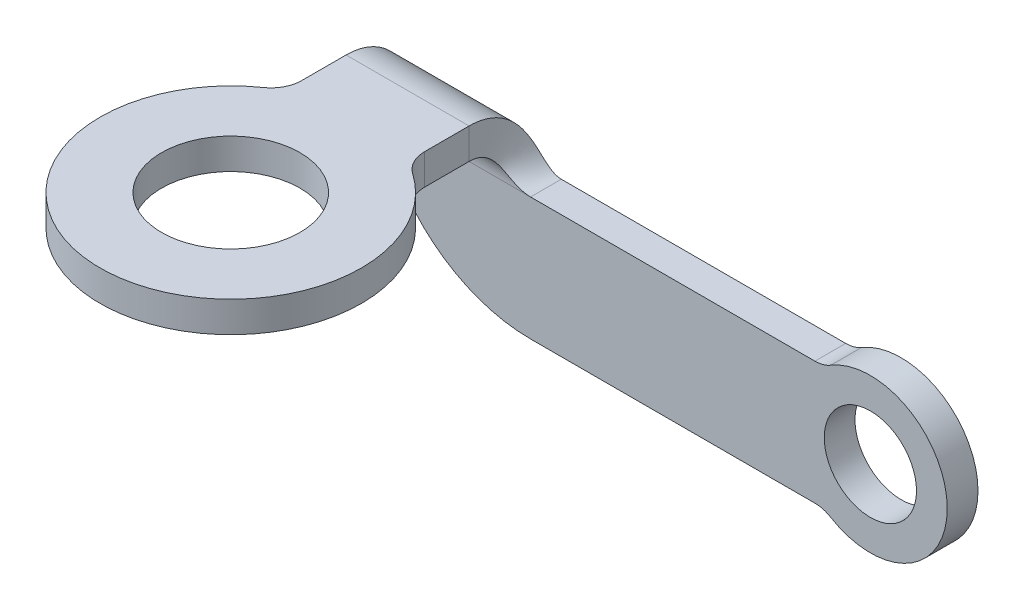
ISO-10303-21;
HEADER;
FILE_DESCRIPTION(('STEP AP214'),'2;1');
FILE_NAME('part.step','',(''),(''),'','','');
FILE_SCHEMA(('AUTOMOTIVE_DESIGN { 1 0 10303 214 1 1 1 1 }'));
ENDSEC;
DATA;
#1=APPLICATION_CONTEXT('core data for automotive mechanical design processes');
#2=APPLICATION_PROTOCOL_DEFINITION('international standard','automotive_design',2000,#1);
#3=PRODUCT_CONTEXT('',#1,'mechanical');
#4=PRODUCT('Part','Part','',(#3));
#5=PRODUCT_RELATED_PRODUCT_CATEGORY('part','',(#4));
#6=PRODUCT_DEFINITION_FORMATION('','',#4);
#7=PRODUCT_DEFINITION_CONTEXT('part definition',#1,'design');
#8=PRODUCT_DEFINITION('design','',#6,#7);
#9=PRODUCT_DEFINITION_SHAPE('','',#8);
#10=(LENGTH_UNIT() NAMED_UNIT(*) SI_UNIT(.MILLI.,.METRE.));
#11=(NAMED_UNIT(*) PLANE_ANGLE_UNIT() SI_UNIT($,.RADIAN.));
#12=(NAMED_UNIT(*) SI_UNIT($,.STERADIAN.) SOLID_ANGLE_UNIT());
#13=UNCERTAINTY_MEASURE_WITH_UNIT(LENGTH_MEASURE(1.E-05),#10,'distance_accuracy_value','');
#14=(GEOMETRIC_REPRESENTATION_CONTEXT(3) GLOBAL_UNCERTAINTY_ASSIGNED_CONTEXT((#13)) GLOBAL_UNIT_ASSIGNED_CONTEXT((#10,
#11,#12)) REPRESENTATION_CONTEXT('',''));
#15=CARTESIAN_POINT('',(0.,0.,0.));
#16=DIRECTION('',(0.,0.,1.));
#17=DIRECTION('',(1.,0.,0.));
#18=AXIS2_PLACEMENT_3D('',#15,#16,#17);
#19=CARTESIAN_POINT('',(8.,-11.,1.));
#20=DIRECTION('',(0.,1.,0.));
#21=DIRECTION('',(-1.,0.,0.));
#22=AXIS2_PLACEMENT_3D('',#19,#20,#21);
#23=PLANE('',#22);
#24=DIRECTION('',(0.,0.,1.));
#25=VECTOR('',#24,1.);
#26=CARTESIAN_POINT('',(10.,-11.,1.));
#27=LINE('',#26,#25);
#28=CARTESIAN_POINT('',(10.,-11.,-1.));
#29=VERTEX_POINT('',#28);
#30=CARTESIAN_POINT('',(10.,-11.,1.));
#31=VERTEX_POINT('',#30);
#32=EDGE_CURVE('E11',#29,#31,#27,.T.);
#33=ORIENTED_EDGE('',*,*,#32,.F.);
#34=DIRECTION('',(1.,0.,0.));
#35=VECTOR('',#34,1.);
#36=CARTESIAN_POINT('',(8.,-11.,-1.));
#37=LINE('',#36,#35);
#38=CARTESIAN_POINT('',(28.494448724536,-11.,-1.));
#39=VERTEX_POINT('',#38);
#40=EDGE_CURVE('E141',#39,#29,#37,.F.);
#41=ORIENTED_EDGE('',*,*,#40,.F.);
#42=DIRECTION('',(0.,0.,1.));
#43=VECTOR('',#42,1.);
#44=CARTESIAN_POINT('',(28.494448724536,-11.,1.));
#45=LINE('',#44,#43);
#46=CARTESIAN_POINT('',(28.494448724536,-11.,1.));
#47=VERTEX_POINT('',#46);
#48=EDGE_CURVE('E50',#39,#47,#45,.T.);
#49=ORIENTED_EDGE('',*,*,#48,.T.);
#50=DIRECTION('',(-1.,0.,0.));
#51=VECTOR('',#50,1.);
#52=CARTESIAN_POINT('',(8.,-11.,1.));
#53=LINE('',#52,#51);
#54=EDGE_CURVE('E365',#47,#31,#53,.T.);
#55=ORIENTED_EDGE('',*,*,#54,.T.);
#56=EDGE_LOOP('',(#33,#41,#49,#55));
#57=FACE_BOUND('',#56,.T.);
#58=ADVANCED_FACE('F38',(#57),#23,.F.);
#59=CARTESIAN_POINT('',(28.494448724536,-13.,1.));
#60=DIRECTION('',(0.,0.,1.));
#61=DIRECTION('',(1.,0.,0.));
#62=AXIS2_PLACEMENT_3D('',#59,#60,#61);
#63=CYLINDRICAL_SURFACE('',#62,2.);
#64=ORIENTED_EDGE('',*,*,#48,.F.);
#65=CARTESIAN_POINT('',(28.494448724536,-13.,-1.));
#66=DIRECTION('',(0.,0.,1.));
#67=DIRECTION('',(1.,0.,0.));
#68=AXIS2_PLACEMENT_3D('',#65,#66,#67);
#69=CIRCLE('',#68,2.);
#70=CARTESIAN_POINT('',(29.5246062318114,-11.2857142857143,-1.));
#71=VERTEX_POINT('',#70);
#72=EDGE_CURVE('E404',#39,#71,#69,.F.);
#73=ORIENTED_EDGE('',*,*,#72,.T.);
#74=DIRECTION('',(0.,0.,1.));
#75=VECTOR('',#74,1.);
#76=CARTESIAN_POINT('',(29.5246062318114,-11.2857142857143,1.));
#77=LINE('',#76,#75);
#78=CARTESIAN_POINT('',(29.5246062318114,-11.2857142857143,1.));
#79=VERTEX_POINT('',#78);
#80=EDGE_CURVE('E449',#71,#79,#77,.T.);
#81=ORIENTED_EDGE('',*,*,#80,.T.);
#82=CARTESIAN_POINT('',(28.494448724536,-13.,1.));
#83=DIRECTION('',(0.,0.,1.));
#84=DIRECTION('',(1.,0.,0.));
#85=AXIS2_PLACEMENT_3D('',#82,#83,#84);
#86=CIRCLE('',#85,2.);
#87=EDGE_CURVE('E367',#47,#79,#86,.F.);
#88=ORIENTED_EDGE('',*,*,#87,.F.);
#89=EDGE_LOOP('',(#64,#73,#81,#88));
#90=FACE_BOUND('',#89,.T.);
#91=ADVANCED_FACE('F465',(#90),#63,.F.);
#92=CARTESIAN_POINT('',(32.1,-7.00000000000001,1.));
#93=DIRECTION('',(0.,0.,1.));
#94=DIRECTION('',(1.,0.,0.));
#95=AXIS2_PLACEMENT_3D('',#92,#93,#94);
#96=CYLINDRICAL_SURFACE('',#95,5.);
#97=ORIENTED_EDGE('',*,*,#80,.F.);
#98=CARTESIAN_POINT('',(32.1,-7.00000000000001,-1.));
#99=DIRECTION('',(0.,0.,1.));
#100=DIRECTION('',(1.,0.,0.));
#101=AXIS2_PLACEMENT_3D('',#98,#99,#100);
#102=CIRCLE('',#101,5.);
#103=CARTESIAN_POINT('',(29.5246062318114,-2.71428571428574,-1.));
#104=VERTEX_POINT('',#103);
#105=EDGE_CURVE('E401',#71,#104,#102,.T.);
#106=ORIENTED_EDGE('',*,*,#105,.T.);
#107=DIRECTION('',(0.,0.,1.));
#108=VECTOR('',#107,1.);
#109=CARTESIAN_POINT('',(29.5246062318114,-2.71428571428574,1.));
#110=LINE('',#109,#108);
#111=CARTESIAN_POINT('',(29.5246062318114,-2.71428571428574,1.));
#112=VERTEX_POINT('',#111);
#113=EDGE_CURVE('E446',#104,#112,#110,.T.);
#114=ORIENTED_EDGE('',*,*,#113,.T.);
#115=CARTESIAN_POINT('',(32.1,-7.00000000000001,1.));
#116=DIRECTION('',(0.,0.,1.));
#117=DIRECTION('',(1.,0.,0.));
#118=AXIS2_PLACEMENT_3D('',#115,#116,#117);
#119=CIRCLE('',#118,5.);
#120=EDGE_CURVE('E315',#79,#112,#119,.T.);
#121=ORIENTED_EDGE('',*,*,#120,.F.);
#122=EDGE_LOOP('',(#97,#106,#114,#121));
#123=FACE_BOUND('',#122,.T.);
#124=ADVANCED_FACE('F466',(#123),#96,.T.);
#125=CARTESIAN_POINT('',(28.494448724536,-1.00000000000003,1.));
#126=DIRECTION('',(0.,0.,1.));
#127=DIRECTION('',(1.,0.,0.));
#128=AXIS2_PLACEMENT_3D('',#125,#126,#127);
#129=CYLINDRICAL_SURFACE('',#128,2.);
#130=ORIENTED_EDGE('',*,*,#113,.F.);
#131=CARTESIAN_POINT('',(28.494448724536,-1.00000000000003,-1.));
#132=DIRECTION('',(0.,0.,1.));
#133=DIRECTION('',(1.,0.,0.));
#134=AXIS2_PLACEMENT_3D('',#131,#132,#133);
#135=CIRCLE('',#134,2.);
#136=CARTESIAN_POINT('',(28.494448724536,-3.00000000000003,-1.));
#137=VERTEX_POINT('',#136);
#138=EDGE_CURVE('E393',#104,#137,#135,.F.);
#139=ORIENTED_EDGE('',*,*,#138,.T.);
#140=DIRECTION('',(0.,0.,1.));
#141=VECTOR('',#140,1.);
#142=CARTESIAN_POINT('',(28.494448724536,-3.00000000000003,1.));
#143=LINE('',#142,#141);
#144=CARTESIAN_POINT('',(28.494448724536,-3.00000000000003,1.));
#145=VERTEX_POINT('',#144);
#146=EDGE_CURVE('E440',#137,#145,#143,.T.);
#147=ORIENTED_EDGE('',*,*,#146,.T.);
#148=CARTESIAN_POINT('',(28.494448724536,-1.00000000000003,1.));
#149=DIRECTION('',(0.,0.,1.));
#150=DIRECTION('',(1.,0.,0.));
#151=AXIS2_PLACEMENT_3D('',#148,#149,#150);
#152=CIRCLE('',#151,2.);
#153=EDGE_CURVE('E311',#112,#145,#152,.F.);
#154=ORIENTED_EDGE('',*,*,#153,.F.);
#155=EDGE_LOOP('',(#130,#139,#147,#154));
#156=FACE_BOUND('',#155,.T.);
#157=ADVANCED_FACE('F444',(#156),#129,.F.);
#158=CARTESIAN_POINT('',(31.,-3.00000000000003,1.));
#159=DIRECTION('',(0.,1.,0.));
#160=DIRECTION('',(-1.,0.,0.));
#161=AXIS2_PLACEMENT_3D('',#158,#159,#160);
#162=PLANE('',#161);
#163=ORIENTED_EDGE('',*,*,#146,.F.);
#164=DIRECTION('',(1.,0.,0.));
#165=VECTOR('',#164,1.);
#166=CARTESIAN_POINT('',(8.,-3.00000000000003,-1.));
#167=LINE('',#166,#165);
#168=CARTESIAN_POINT('',(10.,-3.00000000000001,-1.));
#169=VERTEX_POINT('',#168);
#170=EDGE_CURVE('E137',#137,#169,#167,.F.);
#171=ORIENTED_EDGE('',*,*,#170,.T.);
#172=CARTESIAN_POINT('',(10.,-3.00000000000001,1.));
#173=CARTESIAN_POINT('',(10.,-3.00000000000003,-1.));
#174=B_SPLINE_CURVE_WITH_KNOTS('',1,(#172,#173),.UNSPECIFIED.,.F.,.F.,(2,2),(0.,1.),.UNSPECIFIED.);
#175=CARTESIAN_POINT('',(10.,-3.00000000000001,1.));
#176=VERTEX_POINT('',#175);
#177=EDGE_CURVE('E324',#169,#176,#174,.F.);
#178=ORIENTED_EDGE('',*,*,#177,.T.);
#179=DIRECTION('',(-1.,0.,0.));
#180=VECTOR('',#179,1.);
#181=CARTESIAN_POINT('',(31.,-3.00000000000003,1.));
#182=LINE('',#181,#180);
#183=EDGE_CURVE('E307',#145,#176,#182,.T.);
#184=ORIENTED_EDGE('',*,*,#183,.F.);
#185=EDGE_LOOP('',(#163,#171,#178,#184));
#186=FACE_BOUND('',#185,.T.);
#187=ADVANCED_FACE('F229',(#186),#162,.T.);
#188=CARTESIAN_POINT('',(10.,-3.00000000000003,-1.));
#189=CARTESIAN_POINT('',(9.82093477541032,-3.00000000000003,-1.));
#190=CARTESIAN_POINT('',(9.64580122140493,-2.95273684578553,-1.00080865062304));
#191=CARTESIAN_POINT('',(9.30336473890208,-2.76626511587323,-0.99425483270518));
#192=CARTESIAN_POINT('',(9.13755224871009,-2.62611752530206,-0.986566989808087));
#193=CARTESIAN_POINT('',(8.83405868070301,-2.2689931419241,-0.936766876836849));
#194=CARTESIAN_POINT('',(8.69221728699317,-2.0458229083129,-0.893043014859959));
#195=CARTESIAN_POINT('',(8.51168645654295,-1.67754479086531,-0.777257163510993));
#196=CARTESIAN_POINT('',(8.45632197634519,-1.54879822740381,-0.730311712879765));
#197=CARTESIAN_POINT('',(8.35504028231837,-1.2813526416789,-0.614894648225614));
#198=CARTESIAN_POINT('',(8.3089665706863,-1.14168907981914,-0.545675806509528));
#199=CARTESIAN_POINT('',(8.2294107009633,-0.866885772453496,-0.387471046838496));
#200=CARTESIAN_POINT('',(8.19536135329952,-0.730451480555486,-0.298065230284524));
#201=CARTESIAN_POINT('',(8.13704983269021,-0.462536017914824,-0.0966693857990296));
#202=CARTESIAN_POINT('',(8.11269448566674,-0.330142446376479,0.0163808530445416));
#203=CARTESIAN_POINT('',(8.07342327426585,-0.0817466546383528,0.25884696103896));
#204=CARTESIAN_POINT('',(8.0582483751741,0.0351941513241525,0.388739794267057));
#205=CARTESIAN_POINT('',(8.03437747330826,0.253166587555796,0.665906910192448));
#206=CARTESIAN_POINT('',(8.02568313458191,0.354566979721533,0.814054563014717));
#207=CARTESIAN_POINT('',(8.01304263541525,0.534925974437725,1.11963422968819));
#208=CARTESIAN_POINT('',(8.00900018172403,0.61464752403954,1.27783423806854));
#209=CARTESIAN_POINT('',(8.0035140715089,0.75303161016686,1.60490668136411));
#210=CARTESIAN_POINT('',(8.00207332198609,0.811963269080384,1.774986775512));
#211=CARTESIAN_POINT('',(7.99958972016319,0.952647391751701,2.29044798891665));
#212=CARTESIAN_POINT('',(8.,0.999999999999998,2.64152132330197));
#213=CARTESIAN_POINT('',(8.,1.,2.99999999999998));
#214=CARTESIAN_POINT('',(10.,-3.00000000000001,1.));
#215=CARTESIAN_POINT('',(9.82093477541032,-3.00000000000001,1.));
#216=CARTESIAN_POINT('',(9.64580122140493,-2.97636842289277,0.999595674688481));
#217=CARTESIAN_POINT('',(9.30336473890208,-2.88313255793662,1.00287258364741));
#218=CARTESIAN_POINT('',(9.13755224871009,-2.81305876265103,1.00671650509596));
#219=CARTESIAN_POINT('',(8.83405868070301,-2.63449657096205,1.03161656158158));
#220=CARTESIAN_POINT('',(8.69221728699317,-2.52291145415645,1.05347849257002));
#221=CARTESIAN_POINT('',(8.51168645654295,-2.33877239543265,1.1113714182445));
#222=CARTESIAN_POINT('',(8.45632197634519,-2.27439911370191,1.13484414356012));
#223=CARTESIAN_POINT('',(8.35504028231837,-2.14067632083945,1.19255267588719));
#224=CARTESIAN_POINT('',(8.3089665706863,-2.07084453990957,1.22716209674524));
#225=CARTESIAN_POINT('',(8.2294107009633,-1.93344288622675,1.30626447658075));
#226=CARTESIAN_POINT('',(8.19536135329952,-1.86522574027774,1.35096738485774));
#227=CARTESIAN_POINT('',(8.13704983269021,-1.73126800895741,1.45166530710049));
#228=CARTESIAN_POINT('',(8.11269448566674,-1.66507122318824,1.50819042652227));
#229=CARTESIAN_POINT('',(8.07342327426585,-1.54087332731918,1.62942348051948));
#230=CARTESIAN_POINT('',(8.0582483751741,-1.48240292433792,1.69436989713353));
#231=CARTESIAN_POINT('',(8.03437747330826,-1.3734167062221,1.83295345509622));
#232=CARTESIAN_POINT('',(8.02568313458191,-1.32271651013923,1.90702728150736));
#233=CARTESIAN_POINT('',(8.01304263541525,-1.23253701278114,2.05981711484409));
#234=CARTESIAN_POINT('',(8.00900018172403,-1.19267623798023,2.13891711903427));
#235=CARTESIAN_POINT('',(8.0035140715089,-1.12348419491657,2.30245334068206));
#236=CARTESIAN_POINT('',(8.00207332198609,-1.09401836545981,2.387493387756));
#237=CARTESIAN_POINT('',(7.99958972016319,-1.02367630412415,2.64522399445832));
#238=CARTESIAN_POINT('',(8.,-1.,2.82076066165099));
#239=CARTESIAN_POINT('',(8.,-1.,2.99999999999999));
#240=B_SPLINE_SURFACE_WITH_KNOTS('',1,3,((#188,#189,#190,#191,#192,#193,#194,#195,#196,#197,
#198,#199,#200,#201,#202,#203,#204,#205,#206,#207,#208,#209,#210,#211,#212,#213),(#214,#215,
#216,#217,#218,#219,#220,#221,#222,#223,#224,#225,#226,#227,#228,#229,#230,#231,#232,#233,#234,
#235,#236,#237,#238,#239)),.UNSPECIFIED.,.F.,.F.,.F.,(2,2),(4,2,2,2,2,2,2,2,2,2,2,2,4),(0.,1.),
(0.,0.000529781619363751,0.0010595632387275,0.00158934485809125,0.00185423566777313,
0.002119126477455,0.00238401728713688,0.00264890809681876,0.00291379890650063,
0.00317868971618251,0.00344358052586438,0.00370847133554626,0.00423825295491001),.UNSPECIFIED.);
#241=CARTESIAN_POINT('',(10.,-3.00000000000003,-1.));
#242=CARTESIAN_POINT('',(9.82093477541032,-3.00000000000003,-1.));
#243=CARTESIAN_POINT('',(9.64580122140493,-2.95273684578553,-1.00080865062304));
#244=CARTESIAN_POINT('',(9.30336473890208,-2.76626511587323,-0.99425483270518));
#245=CARTESIAN_POINT('',(9.13755224871009,-2.62611752530206,-0.986566989808087));
#246=CARTESIAN_POINT('',(8.83405868070301,-2.2689931419241,-0.936766876836849));
#247=CARTESIAN_POINT('',(8.69221728699317,-2.0458229083129,-0.893043014859959));
#248=CARTESIAN_POINT('',(8.51168645654295,-1.67754479086531,-0.777257163510993));
#249=CARTESIAN_POINT('',(8.45632197634519,-1.54879822740381,-0.730311712879765));
#250=CARTESIAN_POINT('',(8.35504028231837,-1.2813526416789,-0.614894648225614));
#251=CARTESIAN_POINT('',(8.3089665706863,-1.14168907981914,-0.545675806509528));
#252=CARTESIAN_POINT('',(8.2294107009633,-0.866885772453496,-0.387471046838496));
#253=CARTESIAN_POINT('',(8.19536135329952,-0.730451480555486,-0.298065230284524));
#254=CARTESIAN_POINT('',(8.13704983269021,-0.462536017914824,-0.0966693857990296));
#255=CARTESIAN_POINT('',(8.11269448566674,-0.330142446376479,0.0163808530445416));
#256=CARTESIAN_POINT('',(8.07342327426585,-0.0817466546383528,0.25884696103896));
#257=CARTESIAN_POINT('',(8.0582483751741,0.0351941513241525,0.388739794267057));
#258=CARTESIAN_POINT('',(8.03437747330826,0.253166587555796,0.665906910192448));
#259=CARTESIAN_POINT('',(8.02568313458191,0.354566979721533,0.814054563014717));
#260=CARTESIAN_POINT('',(8.01304263541525,0.534925974437725,1.11963422968819));
#261=CARTESIAN_POINT('',(8.00900018172403,0.61464752403954,1.27783423806854));
#262=CARTESIAN_POINT('',(8.0035140715089,0.75303161016686,1.60490668136411));
#263=CARTESIAN_POINT('',(8.00207332198609,0.811963269080384,1.774986775512));
#264=CARTESIAN_POINT('',(7.99958972016319,0.952647391751701,2.29044798891665));
#265=CARTESIAN_POINT('',(8.,0.999999999999998,2.64152132330197));
#266=CARTESIAN_POINT('',(8.,1.,2.99999999999998));
#267=B_SPLINE_CURVE_WITH_KNOTS('',3,(#241,#242,#243,#244,#245,#246,#247,#248,#249,#250,#251,
#252,#253,#254,#255,#256,#257,#258,#259,#260,#261,#262,#263,#264,#265,#266),.UNSPECIFIED.,.F.,
.F.,(4,2,2,2,2,2,2,2,2,2,2,2,4),(0.,0.000529781619363751,0.0010595632387275,0.00158934485809125,
0.00185423566777313,0.002119126477455,0.00238401728713688,0.00264890809681876,
0.00291379890650063,0.00317868971618251,0.00344358052586438,0.00370847133554626,
0.00423825295491001),.UNSPECIFIED.);
#268=CARTESIAN_POINT('',(8.,1.,3.00000000000004));
#269=VERTEX_POINT('',#268);
#270=EDGE_CURVE('E132',#169,#269,#267,.T.);
#271=CARTESIAN_POINT('',(8.,1.,2.99999999999998));
#272=CARTESIAN_POINT('',(8.,-1.,2.99999999999999));
#273=B_SPLINE_CURVE_WITH_KNOTS('',1,(#271,#272),.UNSPECIFIED.,.F.,.F.,(2,2),(0.,1.),.UNSPECIFIED.);
#274=CARTESIAN_POINT('',(8.,-1.,3.00000000000002));
#275=VERTEX_POINT('',#274);
#276=EDGE_CURVE('E204',#269,#275,#273,.T.);
#277=CARTESIAN_POINT('',(8.,-1.,2.99999999999999));
#278=CARTESIAN_POINT('',(8.,-1.,2.82076066165099));
#279=CARTESIAN_POINT('',(7.99958972016319,-1.02367630412415,2.64522399445832));
#280=CARTESIAN_POINT('',(8.00207332198609,-1.09401836545981,2.387493387756));
#281=CARTESIAN_POINT('',(8.0035140715089,-1.12348419491657,2.30245334068206));
#282=CARTESIAN_POINT('',(8.00900018172403,-1.19267623798023,2.13891711903427));
#283=CARTESIAN_POINT('',(8.01304263541525,-1.23253701278114,2.05981711484409));
#284=CARTESIAN_POINT('',(8.02568313458191,-1.32271651013923,1.90702728150736));
#285=CARTESIAN_POINT('',(8.03437747330826,-1.3734167062221,1.83295345509622));
#286=CARTESIAN_POINT('',(8.0582483751741,-1.48240292433792,1.69436989713353));
#287=CARTESIAN_POINT('',(8.07342327426585,-1.54087332731918,1.62942348051948));
#288=CARTESIAN_POINT('',(8.11269448566674,-1.66507122318824,1.50819042652227));
#289=CARTESIAN_POINT('',(8.13704983269021,-1.73126800895741,1.45166530710049));
#290=CARTESIAN_POINT('',(8.19536135329952,-1.86522574027774,1.35096738485774));
#291=CARTESIAN_POINT('',(8.2294107009633,-1.93344288622675,1.30626447658075));
#292=CARTESIAN_POINT('',(8.3089665706863,-2.07084453990957,1.22716209674524));
#293=CARTESIAN_POINT('',(8.35504028231837,-2.14067632083945,1.19255267588719));
#294=CARTESIAN_POINT('',(8.45632197634519,-2.27439911370191,1.13484414356012));
#295=CARTESIAN_POINT('',(8.51168645654295,-2.33877239543265,1.1113714182445));
#296=CARTESIAN_POINT('',(8.69221728699317,-2.52291145415645,1.05347849257002));
#297=CARTESIAN_POINT('',(8.83405868070301,-2.63449657096205,1.03161656158158));
#298=CARTESIAN_POINT('',(9.13755224871009,-2.81305876265103,1.00671650509596));
#299=CARTESIAN_POINT('',(9.30336473890208,-2.88313255793662,1.00287258364741));
#300=CARTESIAN_POINT('',(9.64580122140493,-2.97636842289277,0.999595674688481));
#301=CARTESIAN_POINT('',(9.82093477541032,-3.00000000000001,1.));
#302=CARTESIAN_POINT('',(10.,-3.00000000000001,1.));
#303=B_SPLINE_CURVE_WITH_KNOTS('',3,(#277,#278,#279,#280,#281,#282,#283,#284,#285,#286,#287,
#288,#289,#290,#291,#292,#293,#294,#295,#296,#297,#298,#299,#300,#301,#302),.UNSPECIFIED.,.F.,
.F.,(4,2,2,2,2,2,2,2,2,2,2,2,4),(0.,0.000529781619363751,0.000794672429045627,
0.0010595632387275,0.00132445404840938,0.00158934485809125,0.00185423566777313,
0.002119126477455,0.00238401728713688,0.00264890809681876,0.00317868971618251,
0.00370847133554626,0.00423825295491001),.UNSPECIFIED.);
#304=EDGE_CURVE('E119',#176,#275,#303,.F.);
#305=ORIENTED_EDGE('',*,*,#177,.F.);
#306=ORIENTED_EDGE('',*,*,#270,.T.);
#307=ORIENTED_EDGE('',*,*,#276,.T.);
#308=ORIENTED_EDGE('',*,*,#304,.F.);
#309=EDGE_LOOP('',(#305,#306,#307,#308));
#310=FACE_BOUND('',#309,.T.);
#311=ADVANCED_FACE('F216',(#310),#240,.F.);
#312=CARTESIAN_POINT('',(8.,-1.,3.00000000000002));
#313=DIRECTION('',(1.,0.,0.));
#314=DIRECTION('',(0.,0.,1.));
#315=AXIS2_PLACEMENT_3D('',#312,#313,#314);
#316=PLANE('',#315);
#317=ORIENTED_EDGE('',*,*,#276,.F.);
#318=DIRECTION('',(0.,0.,-1.));
#319=VECTOR('',#318,1.);
#320=CARTESIAN_POINT('',(8.,1.,3.00000000000002));
#321=LINE('',#320,#319);
#322=CARTESIAN_POINT('',(8.,1.,5.88315603019296));
#323=VERTEX_POINT('',#322);
#324=EDGE_CURVE('E423',#269,#323,#321,.F.);
#325=ORIENTED_EDGE('',*,*,#324,.T.);
#326=DIRECTION('',(0.,-1.,0.));
#327=VECTOR('',#326,1.);
#328=CARTESIAN_POINT('',(8.,-1.,5.88315603019296));
#329=LINE('',#328,#327);
#330=CARTESIAN_POINT('',(8.,-1.,5.88315603019296));
#331=VERTEX_POINT('',#330);
#332=EDGE_CURVE('E202',#323,#331,#329,.T.);
#333=ORIENTED_EDGE('',*,*,#332,.T.);
#334=DIRECTION('',(0.,0.,1.));
#335=VECTOR('',#334,1.);
#336=CARTESIAN_POINT('',(8.,-1.,3.00000000000002));
#337=LINE('',#336,#335);
#338=EDGE_CURVE('E157',#275,#331,#337,.T.);
#339=ORIENTED_EDGE('',*,*,#338,.F.);
#340=EDGE_LOOP('',(#317,#325,#333,#339));
#341=FACE_BOUND('',#340,.T.);
#342=ADVANCED_FACE('F228',(#341),#316,.T.);
#343=CARTESIAN_POINT('',(10.,-1.,5.88315603019296));
#344=DIRECTION('',(0.,-1.,0.));
#345=DIRECTION('',(0.,0.,-1.));
#346=AXIS2_PLACEMENT_3D('',#343,#344,#345);
#347=CYLINDRICAL_SURFACE('',#346,2.);
#348=ORIENTED_EDGE('',*,*,#332,.F.);
#349=CARTESIAN_POINT('',(10.,0.999999999999999,5.88315603019296));
#350=DIRECTION('',(0.,-1.,0.));
#351=DIRECTION('',(0.,0.,-1.));
#352=AXIS2_PLACEMENT_3D('',#349,#350,#351);
#353=CIRCLE('',#352,2.);
#354=CARTESIAN_POINT('',(8.85714285714286,0.999999999999999,7.52445964348954));
#355=VERTEX_POINT('',#354);
#356=EDGE_CURVE('E352',#323,#355,#353,.F.);
#357=ORIENTED_EDGE('',*,*,#356,.T.);
#358=DIRECTION('',(0.,-1.,0.));
#359=VECTOR('',#358,1.);
#360=CARTESIAN_POINT('',(8.85714285714286,-1.,7.52445964348954));
#361=LINE('',#360,#359);
#362=CARTESIAN_POINT('',(8.85714285714286,-1.,7.52445964348954));
#363=VERTEX_POINT('',#362);
#364=EDGE_CURVE('E199',#355,#363,#361,.T.);
#365=ORIENTED_EDGE('',*,*,#364,.T.);
#366=CARTESIAN_POINT('',(10.,-1.,5.88315603019296));
#367=DIRECTION('',(0.,-1.,0.));
#368=DIRECTION('',(0.,0.,-1.));
#369=AXIS2_PLACEMENT_3D('',#366,#367,#368);
#370=CIRCLE('',#369,2.);
#371=EDGE_CURVE('E350',#331,#363,#370,.F.);
#372=ORIENTED_EDGE('',*,*,#371,.F.);
#373=EDGE_LOOP('',(#348,#357,#365,#372));
#374=FACE_BOUND('',#373,.T.);
#375=ADVANCED_FACE('F349',(#374),#347,.F.);
#376=CARTESIAN_POINT('',(4.,-1.,14.5));
#377=DIRECTION('',(0.,-1.,0.));
#378=DIRECTION('',(0.,0.,-1.));
#379=AXIS2_PLACEMENT_3D('',#376,#377,#378);
#380=CYLINDRICAL_SURFACE('',#379,8.5);
#381=ORIENTED_EDGE('',*,*,#364,.F.);
#382=CARTESIAN_POINT('',(4.,0.999999999999999,14.5));
#383=DIRECTION('',(0.,-1.,0.));
#384=DIRECTION('',(0.,0.,-1.));
#385=AXIS2_PLACEMENT_3D('',#382,#383,#384);
#386=CIRCLE('',#385,8.5);
#387=CARTESIAN_POINT('',(-0.857142857142858,0.999999999999999,7.52445964348954));
#388=VERTEX_POINT('',#387);
#389=EDGE_CURVE('E519',#355,#388,#386,.T.);
#390=ORIENTED_EDGE('',*,*,#389,.T.);
#391=DIRECTION('',(0.,-1.,0.));
#392=VECTOR('',#391,1.);
#393=CARTESIAN_POINT('',(-0.857142857142858,-1.,7.52445964348954));
#394=LINE('',#393,#392);
#395=CARTESIAN_POINT('',(-0.857142857142858,-1.,7.52445964348954));
#396=VERTEX_POINT('',#395);
#397=EDGE_CURVE('E196',#388,#396,#394,.T.);
#398=ORIENTED_EDGE('',*,*,#397,.T.);
#399=CARTESIAN_POINT('',(4.,-1.,14.5));
#400=DIRECTION('',(0.,-1.,0.));
#401=DIRECTION('',(0.,0.,-1.));
#402=AXIS2_PLACEMENT_3D('',#399,#400,#401);
#403=CIRCLE('',#402,8.5);
#404=EDGE_CURVE('E357',#363,#396,#403,.T.);
#405=ORIENTED_EDGE('',*,*,#404,.F.);
#406=EDGE_LOOP('',(#381,#390,#398,#405));
#407=FACE_BOUND('',#406,.T.);
#408=ADVANCED_FACE('F359',(#407),#380,.T.);
#409=CARTESIAN_POINT('',(-2.,-1.,5.88315603019296));
#410=DIRECTION('',(0.,-1.,0.));
#411=DIRECTION('',(0.,0.,-1.));
#412=AXIS2_PLACEMENT_3D('',#409,#410,#411);
#413=CYLINDRICAL_SURFACE('',#412,2.);
#414=ORIENTED_EDGE('',*,*,#397,.F.);
#415=CARTESIAN_POINT('',(-2.,0.999999999999999,5.88315603019296));
#416=DIRECTION('',(0.,-1.,0.));
#417=DIRECTION('',(0.,0.,-1.));
#418=AXIS2_PLACEMENT_3D('',#415,#416,#417);
#419=CIRCLE('',#418,2.);
#420=CARTESIAN_POINT('',(0.,1.,5.88315603019296));
#421=VERTEX_POINT('',#420);
#422=EDGE_CURVE('E376',#388,#421,#419,.F.);
#423=ORIENTED_EDGE('',*,*,#422,.T.);
#424=DIRECTION('',(0.,-1.,0.));
#425=VECTOR('',#424,1.);
#426=CARTESIAN_POINT('',(0.,-1.,5.88315603019296));
#427=LINE('',#426,#425);
#428=CARTESIAN_POINT('',(0.,-1.,5.88315603019296));
#429=VERTEX_POINT('',#428);
#430=EDGE_CURVE('E188',#421,#429,#427,.T.);
#431=ORIENTED_EDGE('',*,*,#430,.T.);
#432=CARTESIAN_POINT('',(-2.,-1.,5.88315603019296));
#433=DIRECTION('',(0.,-1.,0.));
#434=DIRECTION('',(0.,0.,-1.));
#435=AXIS2_PLACEMENT_3D('',#432,#433,#434);
#436=CIRCLE('',#435,2.);
#437=EDGE_CURVE('E283',#396,#429,#436,.F.);
#438=ORIENTED_EDGE('',*,*,#437,.F.);
#439=EDGE_LOOP('',(#414,#423,#431,#438));
#440=FACE_BOUND('',#439,.T.);
#441=ADVANCED_FACE('F510',(#440),#413,.F.);
#442=CARTESIAN_POINT('',(0.,-1.,3.00000000000002));
#443=DIRECTION('',(1.,0.,0.));
#444=DIRECTION('',(0.,0.,1.));
#445=AXIS2_PLACEMENT_3D('',#442,#443,#444);
#446=PLANE('',#445);
#447=ORIENTED_EDGE('',*,*,#430,.F.);
#448=DIRECTION('',(0.,0.,-1.));
#449=VECTOR('',#448,1.);
#450=CARTESIAN_POINT('',(0.,1.,3.00000000000002));
#451=LINE('',#450,#449);
#452=CARTESIAN_POINT('',(0.,1.,3.00000000000002));
#453=VERTEX_POINT('',#452);
#454=EDGE_CURVE('E271',#453,#421,#451,.F.);
#455=ORIENTED_EDGE('',*,*,#454,.F.);
#456=CARTESIAN_POINT('',(0.,-0.999999999999999,3.));
#457=CARTESIAN_POINT('',(0.,1.,3.));
#458=B_SPLINE_CURVE_WITH_KNOTS('',1,(#456,#457),.UNSPECIFIED.,.F.,.F.,(2,2),(0.,1.),.UNSPECIFIED.);
#459=CARTESIAN_POINT('',(0.,-1.,3.00000000000002));
#460=VERTEX_POINT('',#459);
#461=EDGE_CURVE('E118',#453,#460,#458,.F.);
#462=ORIENTED_EDGE('',*,*,#461,.T.);
#463=DIRECTION('',(0.,0.,1.));
#464=VECTOR('',#463,1.);
#465=CARTESIAN_POINT('',(0.,-1.,3.00000000000002));
#466=LINE('',#465,#464);
#467=EDGE_CURVE('E269',#460,#429,#466,.T.);
#468=ORIENTED_EDGE('',*,*,#467,.T.);
#469=EDGE_LOOP('',(#447,#455,#462,#468));
#470=FACE_BOUND('',#469,.T.);
#471=ADVANCED_FACE('F170',(#470),#446,.F.);
#472=CARTESIAN_POINT('',(0.,1.,3.));
#473=CARTESIAN_POINT('',(0.,1.,2.73482407852179));
#474=CARTESIAN_POINT('',(-2.41916277895306E-05,0.973888333525783,2.4740607158775));
#475=CARTESIAN_POINT('',(0.000173456148649118,0.871572887465498,1.96109480944714));
#476=CARTESIAN_POINT('',(0.000402202656954475,0.794109626367977,1.70619489826914));
#477=CARTESIAN_POINT('',(0.00195338043008096,0.591992093101197,1.22045165807123));
#478=CARTESIAN_POINT('',(0.00326702599678664,0.468315910789304,0.99012515576955));
#479=CARTESIAN_POINT('',(0.00822091985264886,0.176123893457673,0.554381640584147));
#480=CARTESIAN_POINT('',(0.0119229233860885,0.00612812096292221,0.348281522005469));
#481=CARTESIAN_POINT('',(0.0228780479279752,-0.364795325091616,-0.0206147532452232));
#482=CARTESIAN_POINT('',(0.0301352278642934,-0.567065933076937,-0.185937437893766));
#483=CARTESIAN_POINT('',(0.0498083209062378,-1.00580461024337,-0.477434439301669));
#484=CARTESIAN_POINT('',(0.0621013209501626,-1.23858835254494,-0.600678153130807));
#485=CARTESIAN_POINT('',(0.107104638820287,-1.95920246359771,-0.896993341682054));
#486=CARTESIAN_POINT('',(0.149277621302234,-2.48302629750044,-1.));
#487=CARTESIAN_POINT('',(0.202041028867292,-3.00000000000003,-1.));
#488=CARTESIAN_POINT('',(0.,-0.999999999999999,3.));
#489=CARTESIAN_POINT('',(0.,-0.999999999999999,2.8674120392609));
#490=CARTESIAN_POINT('',(-2.41916277895306E-05,-1.01305583323711,2.73703035793875));
#491=CARTESIAN_POINT('',(0.000173456148649118,-1.06421355626725,2.48054740472357));
#492=CARTESIAN_POINT('',(0.000402202656954475,-1.10294518681601,2.35309744913457));
#493=CARTESIAN_POINT('',(0.00195338043008096,-1.2040039534494,2.11022582903561));
#494=CARTESIAN_POINT('',(0.00326702599678664,-1.26584204460535,1.99506257788477));
#495=CARTESIAN_POINT('',(0.00822091985264886,-1.41193805327116,1.77719082029207));
#496=CARTESIAN_POINT('',(0.0119229233860885,-1.49693593951854,1.67414076100273));
#497=CARTESIAN_POINT('',(0.0228780479279752,-1.68239766254581,1.48969262337739));
#498=CARTESIAN_POINT('',(0.0301352278642934,-1.78353296653847,1.40703128105312));
#499=CARTESIAN_POINT('',(0.0498083209062378,-2.00290230512169,1.26128278034917));
#500=CARTESIAN_POINT('',(0.0621013209501626,-2.11929417627247,1.1996609234346));
#501=CARTESIAN_POINT('',(0.107104638820287,-2.47960123179885,1.05150332915897));
#502=CARTESIAN_POINT('',(0.149270668915452,-2.74147908915,0.999999999999998));
#503=CARTESIAN_POINT('',(0.202041028867292,-3.00000000000001,1.));
#504=B_SPLINE_SURFACE_WITH_KNOTS('',1,3,((#472,#473,#474,#475,#476,#477,#478,#479,#480,#481,
#482,#483,#484,#485,#486,#487),(#488,#489,#490,#491,#492,#493,#494,#495,#496,#497,#498,#499,
#500,#501,#502,#503)),.UNSPECIFIED.,.F.,.F.,.F.,(2,2),(4,2,2,2,2,2,2,4),(0.,1.),(0.,
0.000392146237719091,0.000784292475438162,0.00117643871315723,0.0015685849508763,
0.00196073118859537,0.00235287742631444,0.00313716990175258),.UNSPECIFIED.);
#505=CARTESIAN_POINT('',(0.,1.,3.));
#506=CARTESIAN_POINT('',(0.,1.,2.73482407852179));
#507=CARTESIAN_POINT('',(-2.41916277895306E-05,0.973888333525783,2.4740607158775));
#508=CARTESIAN_POINT('',(0.000173456148649118,0.871572887465498,1.96109480944714));
#509=CARTESIAN_POINT('',(0.000402202656954475,0.794109626367977,1.70619489826914));
#510=CARTESIAN_POINT('',(0.00195338043008096,0.591992093101197,1.22045165807123));
#511=CARTESIAN_POINT('',(0.00326702599678664,0.468315910789304,0.99012515576955));
#512=CARTESIAN_POINT('',(0.00822091985264886,0.176123893457673,0.554381640584147));
#513=CARTESIAN_POINT('',(0.0119229233860885,0.00612812096292221,0.348281522005469));
#514=CARTESIAN_POINT('',(0.0228780479279752,-0.364795325091616,-0.0206147532452232));
#515=CARTESIAN_POINT('',(0.0301352278642934,-0.567065933076937,-0.185937437893766));
#516=CARTESIAN_POINT('',(0.0498083209062378,-1.00580461024337,-0.477434439301669));
#517=CARTESIAN_POINT('',(0.0621013209501626,-1.23858835254494,-0.600678153130807));
#518=CARTESIAN_POINT('',(0.107104638820287,-1.95920246359771,-0.896993341682054));
#519=CARTESIAN_POINT('',(0.149277621302234,-2.48302629750044,-1.));
#520=CARTESIAN_POINT('',(0.202041028867292,-3.00000000000003,-1.));
#521=B_SPLINE_CURVE_WITH_KNOTS('',3,(#505,#506,#507,#508,#509,#510,#511,#512,#513,#514,#515,
#516,#517,#518,#519,#520),.UNSPECIFIED.,.F.,.F.,(4,2,2,2,2,2,2,4),(0.,0.000392146237719091,
0.000784292475438162,0.00117643871315723,0.0015685849508763,0.00196073118859537,
0.00235287742631444,0.00313716990175258),.UNSPECIFIED.);
#522=CARTESIAN_POINT('',(0.202041028867291,-3.00000000000001,-1.));
#523=VERTEX_POINT('',#522);
#524=EDGE_CURVE('E128',#453,#523,#521,.T.);
#525=CARTESIAN_POINT('',(0.202041028867292,-3.00000000000003,-1.));
#526=CARTESIAN_POINT('',(0.202041028867292,-3.00000000000001,1.));
#527=B_SPLINE_CURVE_WITH_KNOTS('',1,(#525,#526),.UNSPECIFIED.,.F.,.F.,(2,2),(0.,1.),.UNSPECIFIED.);
#528=CARTESIAN_POINT('',(0.202041028867291,-3.00000000000001,1.));
#529=VERTEX_POINT('',#528);
#530=EDGE_CURVE('E106',#523,#529,#527,.T.);
#531=CARTESIAN_POINT('',(0.202041028867292,-3.00000000000001,1.));
#532=CARTESIAN_POINT('',(0.149270668915452,-2.74147908915,0.999999999999998));
#533=CARTESIAN_POINT('',(0.107104638820287,-2.47960123179885,1.05150332915897));
#534=CARTESIAN_POINT('',(0.0621013209501626,-2.11929417627247,1.1996609234346));
#535=CARTESIAN_POINT('',(0.0498083209062378,-2.00290230512169,1.26128278034917));
#536=CARTESIAN_POINT('',(0.0301352278642934,-1.78353296653847,1.40703128105312));
#537=CARTESIAN_POINT('',(0.0228780479279752,-1.68239766254581,1.48969262337739));
#538=CARTESIAN_POINT('',(0.0119229233860885,-1.49693593951854,1.67414076100273));
#539=CARTESIAN_POINT('',(0.00822091985264886,-1.41193805327116,1.77719082029207));
#540=CARTESIAN_POINT('',(0.00326702599678664,-1.26584204460535,1.99506257788477));
#541=CARTESIAN_POINT('',(0.00195338043008096,-1.2040039534494,2.11022582903561));
#542=CARTESIAN_POINT('',(0.000402202656954475,-1.10294518681601,2.35309744913457));
#543=CARTESIAN_POINT('',(0.000173456148649118,-1.06421355626725,2.48054740472357));
#544=CARTESIAN_POINT('',(-2.41916277895306E-05,-1.01305583323711,2.73703035793875));
#545=CARTESIAN_POINT('',(0.,-0.999999999999999,2.8674120392609));
#546=CARTESIAN_POINT('',(0.,-0.999999999999999,3.));
#547=B_SPLINE_CURVE_WITH_KNOTS('',3,(#531,#532,#533,#534,#535,#536,#537,#538,#539,#540,#541,
#542,#543,#544,#545,#546),.UNSPECIFIED.,.F.,.F.,(4,2,2,2,2,2,2,4),(0.,0.000784292475438162,
0.00117643871315723,0.0015685849508763,0.00196073118859537,0.00235287742631444,
0.00274502366403351,0.00313716990175258),.UNSPECIFIED.);
#548=EDGE_CURVE('E285',#460,#529,#547,.F.);
#549=ORIENTED_EDGE('',*,*,#461,.F.);
#550=ORIENTED_EDGE('',*,*,#524,.T.);
#551=ORIENTED_EDGE('',*,*,#530,.T.);
#552=ORIENTED_EDGE('',*,*,#548,.F.);
#553=EDGE_LOOP('',(#549,#550,#551,#552));
#554=FACE_BOUND('',#553,.T.);
#555=ADVANCED_FACE('F144',(#554),#504,.F.);
#556=CARTESIAN_POINT('',(4.,-1.,14.5));
#557=DIRECTION('',(0.,-1.,0.));
#558=DIRECTION('',(0.,0.,-1.));
#559=AXIS2_PLACEMENT_3D('',#556,#557,#558);
#560=CYLINDRICAL_SURFACE('',#559,4.5);
#561=CARTESIAN_POINT('',(4.,-1.,14.5));
#562=DIRECTION('',(0.,-1.,0.));
#563=DIRECTION('',(0.,0.,-1.));
#564=AXIS2_PLACEMENT_3D('',#561,#562,#563);
#565=CIRCLE('',#564,4.5);
#566=CARTESIAN_POINT('',(4.,-1.,10.));
#567=VERTEX_POINT('',#566);
#568=EDGE_CURVE('E293',#567,#567,#565,.T.);
#569=ORIENTED_EDGE('',*,*,#568,.T.);
#570=EDGE_LOOP('',(#569));
#571=FACE_BOUND('',#570,.T.);
#572=CARTESIAN_POINT('',(4.,0.999999999999999,14.5));
#573=DIRECTION('',(0.,-1.,0.));
#574=DIRECTION('',(0.,0.,-1.));
#575=AXIS2_PLACEMENT_3D('',#572,#573,#574);
#576=CIRCLE('',#575,4.5);
#577=CARTESIAN_POINT('',(4.,0.999999999999999,10.));
#578=VERTEX_POINT('',#577);
#579=EDGE_CURVE('E411',#578,#578,#576,.T.);
#580=ORIENTED_EDGE('',*,*,#579,.F.);
#581=EDGE_LOOP('',(#580));
#582=FACE_BOUND('',#581,.T.);
#583=ADVANCED_FACE('F40',(#571,#582),#560,.F.);
#584=CARTESIAN_POINT('',(32.1,-7.00000000000001,1.));
#585=DIRECTION('',(0.,0.,1.));
#586=DIRECTION('',(1.,0.,0.));
#587=AXIS2_PLACEMENT_3D('',#584,#585,#586);
#588=CYLINDRICAL_SURFACE('',#587,3.);
#589=CARTESIAN_POINT('',(32.1,-7.00000000000001,1.));
#590=DIRECTION('',(0.,0.,1.));
#591=DIRECTION('',(1.,0.,0.));
#592=AXIS2_PLACEMENT_3D('',#589,#590,#591);
#593=CIRCLE('',#592,3.);
#594=CARTESIAN_POINT('',(35.1,-7.00000000000001,1.));
#595=VERTEX_POINT('',#594);
#596=EDGE_CURVE('E296',#595,#595,#593,.T.);
#597=ORIENTED_EDGE('',*,*,#596,.T.);
#598=EDGE_LOOP('',(#597));
#599=FACE_BOUND('',#598,.T.);
#600=CARTESIAN_POINT('',(32.1,-7.00000000000001,-1.));
#601=DIRECTION('',(0.,0.,1.));
#602=DIRECTION('',(1.,0.,0.));
#603=AXIS2_PLACEMENT_3D('',#600,#601,#602);
#604=CIRCLE('',#603,3.);
#605=CARTESIAN_POINT('',(35.1,-7.00000000000001,-1.));
#606=VERTEX_POINT('',#605);
#607=EDGE_CURVE('E408',#606,#606,#604,.T.);
#608=ORIENTED_EDGE('',*,*,#607,.F.);
#609=EDGE_LOOP('',(#608));
#610=FACE_BOUND('',#609,.T.);
#611=ADVANCED_FACE('F480',(#599,#610),#588,.F.);
#612=CARTESIAN_POINT('',(10.,-0.999999999999999,1.));
#613=DIRECTION('',(0.,0.,1.));
#614=DIRECTION('',(1.,0.,0.));
#615=AXIS2_PLACEMENT_3D('',#612,#613,#614);
#616=CYLINDRICAL_SURFACE('',#615,10.);
#617=CARTESIAN_POINT('',(10.,-0.999999999999999,-1.));
#618=DIRECTION('',(0.,0.,1.));
#619=DIRECTION('',(1.,0.,0.));
#620=AXIS2_PLACEMENT_3D('',#617,#618,#619);
#621=CIRCLE('',#620,10.);
#622=EDGE_CURVE('E110',#523,#29,#621,.T.);
#623=ORIENTED_EDGE('',*,*,#622,.T.);
#624=ORIENTED_EDGE('',*,*,#32,.T.);
#625=CARTESIAN_POINT('',(10.,-0.999999999999999,1.));
#626=DIRECTION('',(0.,0.,1.));
#627=DIRECTION('',(1.,0.,0.));
#628=AXIS2_PLACEMENT_3D('',#625,#626,#627);
#629=CIRCLE('',#628,10.);
#630=EDGE_CURVE('E111',#529,#31,#629,.T.);
#631=ORIENTED_EDGE('',*,*,#630,.F.);
#632=ORIENTED_EDGE('',*,*,#530,.F.);
#633=EDGE_LOOP('',(#623,#624,#631,#632));
#634=FACE_BOUND('',#633,.T.);
#635=ADVANCED_FACE('F108',(#634),#616,.T.);
#636=CARTESIAN_POINT('',(8.,-3.,3.));
#637=DIRECTION('',(-1.,0.,0.));
#638=DIRECTION('',(0.,0.,1.));
#639=AXIS2_PLACEMENT_3D('',#636,#637,#638);
#640=CYLINDRICAL_SURFACE('',#639,2.);
#641=DIRECTION('',(-1.,0.,0.));
#642=VECTOR('',#641,1.);
#643=CARTESIAN_POINT('',(8.,-1.,3.00000000000002));
#644=LINE('',#643,#642);
#645=EDGE_CURVE('E280',#275,#460,#644,.T.);
#646=ORIENTED_EDGE('',*,*,#645,.T.);
#647=ORIENTED_EDGE('',*,*,#548,.T.);
#648=DIRECTION('',(-1.,0.,0.));
#649=VECTOR('',#648,1.);
#650=CARTESIAN_POINT('',(8.,-3.00000000000001,1.));
#651=LINE('',#650,#649);
#652=EDGE_CURVE('E304',#176,#529,#651,.T.);
#653=ORIENTED_EDGE('',*,*,#652,.F.);
#654=ORIENTED_EDGE('',*,*,#304,.T.);
#655=EDGE_LOOP('',(#646,#647,#653,#654));
#656=FACE_BOUND('',#655,.T.);
#657=ADVANCED_FACE('F291',(#656),#640,.F.);
#658=CARTESIAN_POINT('',(8.,-11.,1.));
#659=DIRECTION('',(0.,0.,1.));
#660=DIRECTION('',(1.,0.,0.));
#661=AXIS2_PLACEMENT_3D('',#658,#659,#660);
#662=PLANE('',#661);
#663=ORIENTED_EDGE('',*,*,#596,.F.);
#664=EDGE_LOOP('',(#663));
#665=FACE_BOUND('',#664,.T.);
#666=ORIENTED_EDGE('',*,*,#54,.F.);
#667=ORIENTED_EDGE('',*,*,#87,.T.);
#668=ORIENTED_EDGE('',*,*,#120,.T.);
#669=ORIENTED_EDGE('',*,*,#153,.T.);
#670=ORIENTED_EDGE('',*,*,#183,.T.);
#671=ORIENTED_EDGE('',*,*,#652,.T.);
#672=ORIENTED_EDGE('',*,*,#630,.T.);
#673=EDGE_LOOP('',(#666,#667,#668,#669,#670,#671,#672));
#674=FACE_BOUND('',#673,.T.);
#675=ADVANCED_FACE('F464',(#665,#674),#662,.T.);
#676=CARTESIAN_POINT('',(8.,-1.,3.00000000000002));
#677=DIRECTION('',(0.,-1.,0.));
#678=DIRECTION('',(0.,0.,-1.));
#679=AXIS2_PLACEMENT_3D('',#676,#677,#678);
#680=PLANE('',#679);
#681=ORIENTED_EDGE('',*,*,#338,.T.);
#682=ORIENTED_EDGE('',*,*,#371,.T.);
#683=ORIENTED_EDGE('',*,*,#404,.T.);
#684=ORIENTED_EDGE('',*,*,#437,.T.);
#685=ORIENTED_EDGE('',*,*,#467,.F.);
#686=ORIENTED_EDGE('',*,*,#645,.F.);
#687=EDGE_LOOP('',(#681,#682,#683,#684,#685,#686));
#688=FACE_BOUND('',#687,.T.);
#689=ORIENTED_EDGE('',*,*,#568,.F.);
#690=EDGE_LOOP('',(#689));
#691=FACE_BOUND('',#690,.T.);
#692=ADVANCED_FACE('F277',(#688,#691),#680,.T.);
#693=CARTESIAN_POINT('',(8.,-3.,3.));
#694=DIRECTION('',(-1.,0.,0.));
#695=DIRECTION('',(0.,0.,1.));
#696=AXIS2_PLACEMENT_3D('',#693,#694,#695);
#697=CYLINDRICAL_SURFACE('',#696,4.);
#698=DIRECTION('',(-1.,0.,0.));
#699=VECTOR('',#698,1.);
#700=CARTESIAN_POINT('',(8.,1.,3.00000000000004));
#701=LINE('',#700,#699);
#702=EDGE_CURVE('E414',#269,#453,#701,.T.);
#703=ORIENTED_EDGE('',*,*,#702,.F.);
#704=ORIENTED_EDGE('',*,*,#270,.F.);
#705=DIRECTION('',(1.,0.,0.));
#706=VECTOR('',#705,1.);
#707=CARTESIAN_POINT('',(8.,-3.00000000000001,-1.));
#708=LINE('',#707,#706);
#709=EDGE_CURVE('E125',#169,#523,#708,.F.);
#710=ORIENTED_EDGE('',*,*,#709,.T.);
#711=ORIENTED_EDGE('',*,*,#524,.F.);
#712=EDGE_LOOP('',(#703,#704,#710,#711));
#713=FACE_BOUND('',#712,.T.);
#714=ADVANCED_FACE('F127',(#713),#697,.T.);
#715=CARTESIAN_POINT('',(8.,-11.,-1.));
#716=DIRECTION('',(0.,0.,1.));
#717=DIRECTION('',(1.,0.,0.));
#718=AXIS2_PLACEMENT_3D('',#715,#716,#717);
#719=PLANE('',#718);
#720=ORIENTED_EDGE('',*,*,#607,.T.);
#721=EDGE_LOOP('',(#720));
#722=FACE_BOUND('',#721,.T.);
#723=ORIENTED_EDGE('',*,*,#40,.T.);
#724=ORIENTED_EDGE('',*,*,#622,.F.);
#725=ORIENTED_EDGE('',*,*,#709,.F.);
#726=ORIENTED_EDGE('',*,*,#170,.F.);
#727=ORIENTED_EDGE('',*,*,#138,.F.);
#728=ORIENTED_EDGE('',*,*,#105,.F.);
#729=ORIENTED_EDGE('',*,*,#72,.F.);
#730=EDGE_LOOP('',(#723,#724,#725,#726,#727,#728,#729));
#731=FACE_BOUND('',#730,.T.);
#732=ADVANCED_FACE('F139',(#722,#731),#719,.F.);
#733=CARTESIAN_POINT('',(8.,1.,3.00000000000002));
#734=DIRECTION('',(0.,-1.,0.));
#735=DIRECTION('',(0.,0.,-1.));
#736=AXIS2_PLACEMENT_3D('',#733,#734,#735);
#737=PLANE('',#736);
#738=ORIENTED_EDGE('',*,*,#324,.F.);
#739=ORIENTED_EDGE('',*,*,#702,.T.);
#740=ORIENTED_EDGE('',*,*,#454,.T.);
#741=ORIENTED_EDGE('',*,*,#422,.F.);
#742=ORIENTED_EDGE('',*,*,#389,.F.);
#743=ORIENTED_EDGE('',*,*,#356,.F.);
#744=EDGE_LOOP('',(#738,#739,#740,#741,#742,#743));
#745=FACE_BOUND('',#744,.T.);
#746=ORIENTED_EDGE('',*,*,#579,.T.);
#747=EDGE_LOOP('',(#746));
#748=FACE_BOUND('',#747,.T.);
#749=ADVANCED_FACE('F171',(#745,#748),#737,.F.);
#750=CLOSED_SHELL('',(#58,#91,#124,#157,#187,#311,#342,#375,#408,#441,#471,#555,#583,#611,#635,
#657,#675,#692,#714,#732,#749));
#751=MANIFOLD_SOLID_BREP('B2',#750);
#752=ADVANCED_BREP_SHAPE_REPRESENTATION('',(#18,#751),#14);
#753=SHAPE_DEFINITION_REPRESENTATION(#9,#752);
ENDSEC;
END-ISO-10303-21;
